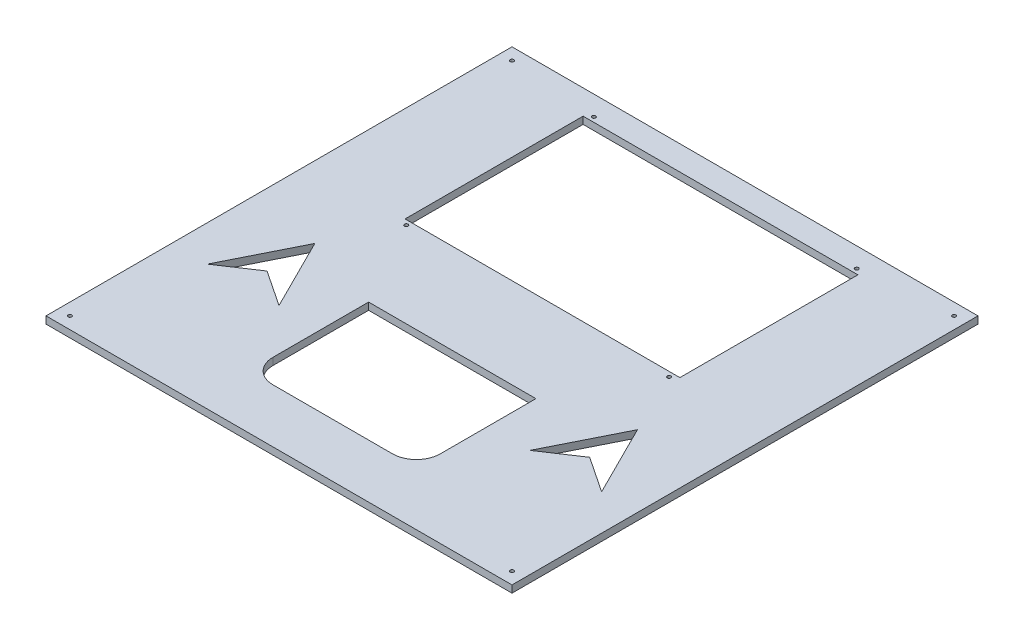
ISO-10303-21;
HEADER;
FILE_DESCRIPTION(('STEP AP214'),'2;1');
FILE_NAME('part.step','',(''),(''),'','','');
FILE_SCHEMA(('AUTOMOTIVE_DESIGN { 1 0 10303 214 1 1 1 1 }'));
ENDSEC;
DATA;
#1=APPLICATION_CONTEXT('core data for automotive mechanical design processes');
#2=APPLICATION_PROTOCOL_DEFINITION('international standard','automotive_design',2000,#1);
#3=PRODUCT_CONTEXT('',#1,'mechanical');
#4=PRODUCT('Part','Part','',(#3));
#5=PRODUCT_RELATED_PRODUCT_CATEGORY('part','',(#4));
#6=PRODUCT_DEFINITION_FORMATION('','',#4);
#7=PRODUCT_DEFINITION_CONTEXT('part definition',#1,'design');
#8=PRODUCT_DEFINITION('design','',#6,#7);
#9=PRODUCT_DEFINITION_SHAPE('','',#8);
#10=(LENGTH_UNIT() NAMED_UNIT(*) SI_UNIT(.MILLI.,.METRE.));
#11=(NAMED_UNIT(*) PLANE_ANGLE_UNIT() SI_UNIT($,.RADIAN.));
#12=(NAMED_UNIT(*) SI_UNIT($,.STERADIAN.) SOLID_ANGLE_UNIT());
#13=UNCERTAINTY_MEASURE_WITH_UNIT(LENGTH_MEASURE(1.E-05),#10,'distance_accuracy_value','');
#14=(GEOMETRIC_REPRESENTATION_CONTEXT(3) GLOBAL_UNCERTAINTY_ASSIGNED_CONTEXT((#13)) GLOBAL_UNIT_ASSIGNED_CONTEXT((#10,
#11,#12)) REPRESENTATION_CONTEXT('',''));
#15=CARTESIAN_POINT('',(0.,0.,0.));
#16=DIRECTION('',(0.,0.,1.));
#17=DIRECTION('',(1.,0.,0.));
#18=AXIS2_PLACEMENT_3D('',#15,#16,#17);
#19=CARTESIAN_POINT('',(0.,6.,0.));
#20=DIRECTION('',(0.,1.,0.));
#21=DIRECTION('',(0.,0.,1.));
#22=AXIS2_PLACEMENT_3D('',#19,#20,#21);
#23=PLANE('',#22);
#24=CARTESIAN_POINT('',(185.,6.,185.));
#25=DIRECTION('',(0.,1.,0.));
#26=DIRECTION('',(0.,0.,1.));
#27=AXIS2_PLACEMENT_3D('',#24,#25,#26);
#28=CIRCLE('',#27,1.5);
#29=CARTESIAN_POINT('',(185.,6.,186.5));
#30=VERTEX_POINT('',#29);
#31=EDGE_CURVE('E300',#30,#30,#28,.T.);
#32=ORIENTED_EDGE('',*,*,#31,.F.);
#33=EDGE_LOOP('',(#32));
#34=FACE_BOUND('',#33,.T.);
#35=CARTESIAN_POINT('',(-185.,6.,-185.));
#36=DIRECTION('',(0.,1.,0.));
#37=DIRECTION('',(0.,0.,1.));
#38=AXIS2_PLACEMENT_3D('',#35,#36,#37);
#39=CIRCLE('',#38,1.5);
#40=CARTESIAN_POINT('',(-185.,6.,-183.5));
#41=VERTEX_POINT('',#40);
#42=EDGE_CURVE('E301',#41,#41,#39,.T.);
#43=ORIENTED_EDGE('',*,*,#42,.F.);
#44=EDGE_LOOP('',(#43));
#45=FACE_BOUND('',#44,.T.);
#46=CARTESIAN_POINT('',(110.,6.,-21.5));
#47=DIRECTION('',(0.,1.,0.));
#48=DIRECTION('',(0.,0.,1.));
#49=AXIS2_PLACEMENT_3D('',#46,#47,#48);
#50=CIRCLE('',#49,1.5);
#51=CARTESIAN_POINT('',(110.,6.,-20.));
#52=VERTEX_POINT('',#51);
#53=EDGE_CURVE('E314',#52,#52,#50,.T.);
#54=ORIENTED_EDGE('',*,*,#53,.F.);
#55=EDGE_LOOP('',(#54));
#56=FACE_BOUND('',#55,.T.);
#57=CARTESIAN_POINT('',(-110.,6.,-178.5));
#58=DIRECTION('',(0.,1.,0.));
#59=DIRECTION('',(0.,0.,1.));
#60=AXIS2_PLACEMENT_3D('',#57,#58,#59);
#61=CIRCLE('',#60,1.5);
#62=CARTESIAN_POINT('',(-110.,6.,-177.));
#63=VERTEX_POINT('',#62);
#64=EDGE_CURVE('E365',#63,#63,#61,.T.);
#65=ORIENTED_EDGE('',*,*,#64,.F.);
#66=EDGE_LOOP('',(#65));
#67=FACE_BOUND('',#66,.T.);
#68=DIRECTION('',(0.,0.,-1.));
#69=VECTOR('',#68,1.);
#70=CARTESIAN_POINT('',(195.,6.,-195.));
#71=LINE('',#70,#69);
#72=CARTESIAN_POINT('',(195.,6.,195.));
#73=VERTEX_POINT('',#72);
#74=CARTESIAN_POINT('',(195.,6.,-195.));
#75=VERTEX_POINT('',#74);
#76=EDGE_CURVE('E445',#73,#75,#71,.T.);
#77=ORIENTED_EDGE('',*,*,#76,.T.);
#78=DIRECTION('',(-1.,0.,0.));
#79=VECTOR('',#78,1.);
#80=CARTESIAN_POINT('',(-195.,6.,-195.));
#81=LINE('',#80,#79);
#82=CARTESIAN_POINT('',(-195.,6.,-195.));
#83=VERTEX_POINT('',#82);
#84=EDGE_CURVE('E449',#75,#83,#81,.T.);
#85=ORIENTED_EDGE('',*,*,#84,.T.);
#86=DIRECTION('',(0.,0.,1.));
#87=VECTOR('',#86,1.);
#88=CARTESIAN_POINT('',(-195.,6.,-195.));
#89=LINE('',#88,#87);
#90=CARTESIAN_POINT('',(-195.,6.,195.));
#91=VERTEX_POINT('',#90);
#92=EDGE_CURVE('E456',#83,#91,#89,.T.);
#93=ORIENTED_EDGE('',*,*,#92,.T.);
#94=DIRECTION('',(1.,0.,0.));
#95=VECTOR('',#94,1.);
#96=CARTESIAN_POINT('',(-195.,6.,195.));
#97=LINE('',#96,#95);
#98=EDGE_CURVE('E459',#91,#73,#97,.T.);
#99=ORIENTED_EDGE('',*,*,#98,.T.);
#100=EDGE_LOOP('',(#77,#85,#93,#99));
#101=FACE_BOUND('',#100,.T.);
#102=DIRECTION('',(-1.,0.,0.));
#103=VECTOR('',#102,1.);
#104=CARTESIAN_POINT('',(-115.,6.,-174.5));
#105=LINE('',#104,#103);
#106=CARTESIAN_POINT('',(115.,6.,-174.5));
#107=VERTEX_POINT('',#106);
#108=CARTESIAN_POINT('',(-115.,6.,-174.5));
#109=VERTEX_POINT('',#108);
#110=EDGE_CURVE('E409',#107,#109,#105,.T.);
#111=ORIENTED_EDGE('',*,*,#110,.F.);
#112=DIRECTION('',(0.,0.,-1.));
#113=VECTOR('',#112,1.);
#114=CARTESIAN_POINT('',(115.,6.,-174.5));
#115=LINE('',#114,#113);
#116=CARTESIAN_POINT('',(115.,6.,-25.5));
#117=VERTEX_POINT('',#116);
#118=EDGE_CURVE('E405',#117,#107,#115,.T.);
#119=ORIENTED_EDGE('',*,*,#118,.F.);
#120=DIRECTION('',(1.,0.,0.));
#121=VECTOR('',#120,1.);
#122=CARTESIAN_POINT('',(-115.,6.,-25.5));
#123=LINE('',#122,#121);
#124=CARTESIAN_POINT('',(-115.,6.,-25.5));
#125=VERTEX_POINT('',#124);
#126=EDGE_CURVE('E418',#125,#117,#123,.T.);
#127=ORIENTED_EDGE('',*,*,#126,.F.);
#128=DIRECTION('',(0.,0.,1.));
#129=VECTOR('',#128,1.);
#130=CARTESIAN_POINT('',(-115.,6.,-174.5));
#131=LINE('',#130,#129);
#132=EDGE_CURVE('E423',#109,#125,#131,.T.);
#133=ORIENTED_EDGE('',*,*,#132,.F.);
#134=EDGE_LOOP('',(#111,#119,#127,#133));
#135=FACE_BOUND('',#134,.T.);
#136=DIRECTION('',(-1.,0.,0.));
#137=VECTOR('',#136,1.);
#138=CARTESIAN_POINT('',(-70.,6.,50.));
#139=LINE('',#138,#137);
#140=CARTESIAN_POINT('',(70.,6.,50.));
#141=VERTEX_POINT('',#140);
#142=CARTESIAN_POINT('',(-70.,6.,50.));
#143=VERTEX_POINT('',#142);
#144=EDGE_CURVE('E341',#141,#143,#139,.T.);
#145=ORIENTED_EDGE('',*,*,#144,.F.);
#146=DIRECTION('',(0.,0.,-1.));
#147=VECTOR('',#146,1.);
#148=CARTESIAN_POINT('',(70.,6.,130.));
#149=LINE('',#148,#147);
#150=CARTESIAN_POINT('',(70.,6.,130.));
#151=VERTEX_POINT('',#150);
#152=EDGE_CURVE('E359',#151,#141,#149,.T.);
#153=ORIENTED_EDGE('',*,*,#152,.F.);
#154=CARTESIAN_POINT('',(50.,6.,130.));
#155=DIRECTION('',(0.,1.,0.));
#156=DIRECTION('',(0.,0.,1.));
#157=AXIS2_PLACEMENT_3D('',#154,#155,#156);
#158=CIRCLE('',#157,20.);
#159=CARTESIAN_POINT('',(50.,6.,150.));
#160=VERTEX_POINT('',#159);
#161=EDGE_CURVE('E352',#160,#151,#158,.T.);
#162=ORIENTED_EDGE('',*,*,#161,.F.);
#163=DIRECTION('',(1.,0.,0.));
#164=VECTOR('',#163,1.);
#165=CARTESIAN_POINT('',(-49.9999999999999,6.,150.));
#166=LINE('',#165,#164);
#167=CARTESIAN_POINT('',(-49.9999999999999,6.,150.));
#168=VERTEX_POINT('',#167);
#169=EDGE_CURVE('E347',#168,#160,#166,.T.);
#170=ORIENTED_EDGE('',*,*,#169,.F.);
#171=CARTESIAN_POINT('',(-50.,6.,130.));
#172=DIRECTION('',(0.,1.,0.));
#173=DIRECTION('',(0.,0.,-1.));
#174=AXIS2_PLACEMENT_3D('',#171,#172,#173);
#175=CIRCLE('',#174,20.);
#176=CARTESIAN_POINT('',(-70.,6.,130.));
#177=VERTEX_POINT('',#176);
#178=EDGE_CURVE('E340',#177,#168,#175,.T.);
#179=ORIENTED_EDGE('',*,*,#178,.F.);
#180=DIRECTION('',(0.,0.,1.));
#181=VECTOR('',#180,1.);
#182=CARTESIAN_POINT('',(-70.,6.,130.));
#183=LINE('',#182,#181);
#184=EDGE_CURVE('E336',#143,#177,#183,.T.);
#185=ORIENTED_EDGE('',*,*,#184,.F.);
#186=EDGE_LOOP('',(#145,#153,#162,#170,#179,#185));
#187=FACE_BOUND('',#186,.T.);
#188=CARTESIAN_POINT('',(-110.,6.,-21.5));
#189=DIRECTION('',(0.,1.,0.));
#190=DIRECTION('',(0.,0.,-1.));
#191=AXIS2_PLACEMENT_3D('',#188,#189,#190);
#192=CIRCLE('',#191,1.5);
#193=CARTESIAN_POINT('',(-110.,6.,-23.));
#194=VERTEX_POINT('',#193);
#195=EDGE_CURVE('E325',#194,#194,#192,.T.);
#196=ORIENTED_EDGE('',*,*,#195,.F.);
#197=EDGE_LOOP('',(#196));
#198=FACE_BOUND('',#197,.T.);
#199=CARTESIAN_POINT('',(110.,6.,-178.5));
#200=DIRECTION('',(0.,1.,0.));
#201=DIRECTION('',(0.,0.,-1.));
#202=AXIS2_PLACEMENT_3D('',#199,#200,#201);
#203=CIRCLE('',#202,1.5);
#204=CARTESIAN_POINT('',(110.,6.,-180.));
#205=VERTEX_POINT('',#204);
#206=EDGE_CURVE('E324',#205,#205,#203,.T.);
#207=ORIENTED_EDGE('',*,*,#206,.F.);
#208=EDGE_LOOP('',(#207));
#209=FACE_BOUND('',#208,.T.);
#210=CARTESIAN_POINT('',(-185.,6.,185.));
#211=DIRECTION('',(0.,1.,0.));
#212=DIRECTION('',(0.,0.,-1.));
#213=AXIS2_PLACEMENT_3D('',#210,#211,#212);
#214=CIRCLE('',#213,1.5);
#215=CARTESIAN_POINT('',(-185.,6.,183.5));
#216=VERTEX_POINT('',#215);
#217=EDGE_CURVE('E290',#216,#216,#214,.T.);
#218=ORIENTED_EDGE('',*,*,#217,.F.);
#219=EDGE_LOOP('',(#218));
#220=FACE_BOUND('',#219,.T.);
#221=CARTESIAN_POINT('',(185.,6.,-185.));
#222=DIRECTION('',(0.,1.,0.));
#223=DIRECTION('',(0.,0.,-1.));
#224=AXIS2_PLACEMENT_3D('',#221,#222,#223);
#225=CIRCLE('',#224,1.5);
#226=CARTESIAN_POINT('',(185.,6.,-186.5));
#227=VERTEX_POINT('',#226);
#228=EDGE_CURVE('E278',#227,#227,#225,.T.);
#229=ORIENTED_EDGE('',*,*,#228,.F.);
#230=EDGE_LOOP('',(#229));
#231=FACE_BOUND('',#230,.T.);
#232=DIRECTION('',(0.832050294337844,0.,0.554700196225228));
#233=VECTOR('',#232,1.);
#234=CARTESIAN_POINT('',(-105.,6.,90.));
#235=LINE('',#234,#233);
#236=CARTESIAN_POINT('',(-135.,6.,70.));
#237=VERTEX_POINT('',#236);
#238=CARTESIAN_POINT('',(-105.,6.,90.));
#239=VERTEX_POINT('',#238);
#240=EDGE_CURVE('E244',#237,#239,#235,.T.);
#241=ORIENTED_EDGE('',*,*,#240,.F.);
#242=DIRECTION('',(0.832050294337843,0.,-0.55470019622523));
#243=VECTOR('',#242,1.);
#244=CARTESIAN_POINT('',(-165.,6.,90.));
#245=LINE('',#244,#243);
#246=CARTESIAN_POINT('',(-165.,6.,90.));
#247=VERTEX_POINT('',#246);
#248=EDGE_CURVE('E240',#247,#237,#245,.T.);
#249=ORIENTED_EDGE('',*,*,#248,.F.);
#250=DIRECTION('',(-0.447213595499958,0.,0.894427190999916));
#251=VECTOR('',#250,1.);
#252=CARTESIAN_POINT('',(-165.,6.,90.));
#253=LINE('',#252,#251);
#254=CARTESIAN_POINT('',(-135.,6.,30.));
#255=VERTEX_POINT('',#254);
#256=EDGE_CURVE('E251',#255,#247,#253,.T.);
#257=ORIENTED_EDGE('',*,*,#256,.F.);
#258=DIRECTION('',(-0.447213595499958,0.,-0.894427190999916));
#259=VECTOR('',#258,1.);
#260=CARTESIAN_POINT('',(-105.,6.,90.));
#261=LINE('',#260,#259);
#262=EDGE_CURVE('E256',#239,#255,#261,.T.);
#263=ORIENTED_EDGE('',*,*,#262,.F.);
#264=EDGE_LOOP('',(#241,#249,#257,#263));
#265=FACE_BOUND('',#264,.T.);
#266=DIRECTION('',(0.832050294337844,0.,0.554700196225229));
#267=VECTOR('',#266,1.);
#268=CARTESIAN_POINT('',(165.,6.,90.));
#269=LINE('',#268,#267);
#270=CARTESIAN_POINT('',(135.,6.,70.));
#271=VERTEX_POINT('',#270);
#272=CARTESIAN_POINT('',(165.,6.,90.));
#273=VERTEX_POINT('',#272);
#274=EDGE_CURVE('E200',#271,#273,#269,.T.);
#275=ORIENTED_EDGE('',*,*,#274,.F.);
#276=DIRECTION('',(0.832050294337844,0.,-0.554700196225229));
#277=VECTOR('',#276,1.);
#278=CARTESIAN_POINT('',(105.,6.,90.));
#279=LINE('',#278,#277);
#280=CARTESIAN_POINT('',(105.,6.,90.));
#281=VERTEX_POINT('',#280);
#282=EDGE_CURVE('E191',#281,#271,#279,.T.);
#283=ORIENTED_EDGE('',*,*,#282,.F.);
#284=DIRECTION('',(-0.447213595499959,0.,0.894427190999915));
#285=VECTOR('',#284,1.);
#286=CARTESIAN_POINT('',(105.,6.,90.));
#287=LINE('',#286,#285);
#288=CARTESIAN_POINT('',(135.,6.,30.));
#289=VERTEX_POINT('',#288);
#290=EDGE_CURVE('E217',#289,#281,#287,.T.);
#291=ORIENTED_EDGE('',*,*,#290,.F.);
#292=DIRECTION('',(-0.447213595499957,0.,-0.894427190999917));
#293=VECTOR('',#292,1.);
#294=CARTESIAN_POINT('',(165.,6.,90.));
#295=LINE('',#294,#293);
#296=EDGE_CURVE('E212',#273,#289,#295,.T.);
#297=ORIENTED_EDGE('',*,*,#296,.F.);
#298=EDGE_LOOP('',(#275,#283,#291,#297));
#299=FACE_BOUND('',#298,.T.);
#300=ADVANCED_FACE('F42',(#34,#45,#56,#67,#101,#135,#187,#198,#209,#220,#231,#265,#299),#23,.T.);
#301=CARTESIAN_POINT('',(0.,0.,0.));
#302=DIRECTION('',(0.,1.,0.));
#303=DIRECTION('',(0.,0.,1.));
#304=AXIS2_PLACEMENT_3D('',#301,#302,#303);
#305=PLANE('',#304);
#306=DIRECTION('',(0.832050294337843,0.,-0.55470019622523));
#307=VECTOR('',#306,1.);
#308=CARTESIAN_POINT('',(-165.,0.,90.));
#309=LINE('',#308,#307);
#310=CARTESIAN_POINT('',(-165.,0.,90.));
#311=VERTEX_POINT('',#310);
#312=CARTESIAN_POINT('',(-135.,0.,70.));
#313=VERTEX_POINT('',#312);
#314=EDGE_CURVE('E208',#311,#313,#309,.T.);
#315=ORIENTED_EDGE('',*,*,#314,.T.);
#316=DIRECTION('',(0.832050294337844,0.,0.554700196225228));
#317=VECTOR('',#316,1.);
#318=CARTESIAN_POINT('',(-105.,0.,90.));
#319=LINE('',#318,#317);
#320=CARTESIAN_POINT('',(-105.,0.,90.));
#321=VERTEX_POINT('',#320);
#322=EDGE_CURVE('E260',#313,#321,#319,.T.);
#323=ORIENTED_EDGE('',*,*,#322,.T.);
#324=DIRECTION('',(-0.447213595499958,0.,-0.894427190999916));
#325=VECTOR('',#324,1.);
#326=CARTESIAN_POINT('',(-105.,0.,90.));
#327=LINE('',#326,#325);
#328=CARTESIAN_POINT('',(-135.,0.,30.));
#329=VERTEX_POINT('',#328);
#330=EDGE_CURVE('E263',#321,#329,#327,.T.);
#331=ORIENTED_EDGE('',*,*,#330,.T.);
#332=DIRECTION('',(-0.447213595499958,0.,0.894427190999916));
#333=VECTOR('',#332,1.);
#334=CARTESIAN_POINT('',(-165.,0.,90.));
#335=LINE('',#334,#333);
#336=EDGE_CURVE('E245',#329,#311,#335,.T.);
#337=ORIENTED_EDGE('',*,*,#336,.T.);
#338=EDGE_LOOP('',(#315,#323,#331,#337));
#339=FACE_BOUND('',#338,.T.);
#340=DIRECTION('',(0.,0.,-1.));
#341=VECTOR('',#340,1.);
#342=CARTESIAN_POINT('',(115.,0.,-174.5));
#343=LINE('',#342,#341);
#344=CARTESIAN_POINT('',(115.,0.,-25.5));
#345=VERTEX_POINT('',#344);
#346=CARTESIAN_POINT('',(115.,0.,-174.5));
#347=VERTEX_POINT('',#346);
#348=EDGE_CURVE('E404',#345,#347,#343,.T.);
#349=ORIENTED_EDGE('',*,*,#348,.T.);
#350=DIRECTION('',(-1.,0.,0.));
#351=VECTOR('',#350,1.);
#352=CARTESIAN_POINT('',(-115.,0.,-174.5));
#353=LINE('',#352,#351);
#354=CARTESIAN_POINT('',(-115.,0.,-174.5));
#355=VERTEX_POINT('',#354);
#356=EDGE_CURVE('E427',#347,#355,#353,.T.);
#357=ORIENTED_EDGE('',*,*,#356,.T.);
#358=DIRECTION('',(0.,0.,1.));
#359=VECTOR('',#358,1.);
#360=CARTESIAN_POINT('',(-115.,0.,-174.5));
#361=LINE('',#360,#359);
#362=CARTESIAN_POINT('',(-115.,0.,-25.5));
#363=VERTEX_POINT('',#362);
#364=EDGE_CURVE('E430',#355,#363,#361,.T.);
#365=ORIENTED_EDGE('',*,*,#364,.T.);
#366=DIRECTION('',(1.,0.,0.));
#367=VECTOR('',#366,1.);
#368=CARTESIAN_POINT('',(-115.,0.,-25.5));
#369=LINE('',#368,#367);
#370=EDGE_CURVE('E410',#363,#345,#369,.T.);
#371=ORIENTED_EDGE('',*,*,#370,.T.);
#372=EDGE_LOOP('',(#349,#357,#365,#371));
#373=FACE_BOUND('',#372,.T.);
#374=DIRECTION('',(0.,0.,-1.));
#375=VECTOR('',#374,1.);
#376=CARTESIAN_POINT('',(195.,0.,-195.));
#377=LINE('',#376,#375);
#378=CARTESIAN_POINT('',(195.,0.,195.));
#379=VERTEX_POINT('',#378);
#380=CARTESIAN_POINT('',(195.,0.,-195.));
#381=VERTEX_POINT('',#380);
#382=EDGE_CURVE('E444',#379,#381,#377,.T.);
#383=ORIENTED_EDGE('',*,*,#382,.F.);
#384=DIRECTION('',(1.,0.,0.));
#385=VECTOR('',#384,1.);
#386=CARTESIAN_POINT('',(-195.,0.,195.));
#387=LINE('',#386,#385);
#388=CARTESIAN_POINT('',(-195.,0.,195.));
#389=VERTEX_POINT('',#388);
#390=EDGE_CURVE('E450',#389,#379,#387,.T.);
#391=ORIENTED_EDGE('',*,*,#390,.F.);
#392=DIRECTION('',(0.,0.,1.));
#393=VECTOR('',#392,1.);
#394=CARTESIAN_POINT('',(-195.,0.,-195.));
#395=LINE('',#394,#393);
#396=CARTESIAN_POINT('',(-195.,0.,-195.));
#397=VERTEX_POINT('',#396);
#398=EDGE_CURVE('E468',#397,#389,#395,.T.);
#399=ORIENTED_EDGE('',*,*,#398,.F.);
#400=DIRECTION('',(-1.,0.,0.));
#401=VECTOR('',#400,1.);
#402=CARTESIAN_POINT('',(-195.,0.,-195.));
#403=LINE('',#402,#401);
#404=EDGE_CURVE('E466',#381,#397,#403,.T.);
#405=ORIENTED_EDGE('',*,*,#404,.F.);
#406=EDGE_LOOP('',(#383,#391,#399,#405));
#407=FACE_BOUND('',#406,.T.);
#408=DIRECTION('',(0.,0.,-1.));
#409=VECTOR('',#408,1.);
#410=CARTESIAN_POINT('',(70.,0.,130.));
#411=LINE('',#410,#409);
#412=CARTESIAN_POINT('',(70.,0.,130.));
#413=VERTEX_POINT('',#412);
#414=CARTESIAN_POINT('',(70.,0.,50.));
#415=VERTEX_POINT('',#414);
#416=EDGE_CURVE('E369',#413,#415,#411,.T.);
#417=ORIENTED_EDGE('',*,*,#416,.T.);
#418=DIRECTION('',(-1.,0.,0.));
#419=VECTOR('',#418,1.);
#420=CARTESIAN_POINT('',(-70.,0.,50.));
#421=LINE('',#420,#419);
#422=CARTESIAN_POINT('',(-70.,0.,50.));
#423=VERTEX_POINT('',#422);
#424=EDGE_CURVE('E374',#415,#423,#421,.T.);
#425=ORIENTED_EDGE('',*,*,#424,.T.);
#426=DIRECTION('',(0.,0.,1.));
#427=VECTOR('',#426,1.);
#428=CARTESIAN_POINT('',(-70.,0.,130.));
#429=LINE('',#428,#427);
#430=CARTESIAN_POINT('',(-70.,0.,130.));
#431=VERTEX_POINT('',#430);
#432=EDGE_CURVE('E378',#423,#431,#429,.T.);
#433=ORIENTED_EDGE('',*,*,#432,.T.);
#434=CARTESIAN_POINT('',(-50.,0.,130.));
#435=DIRECTION('',(0.,1.,0.));
#436=DIRECTION('',(0.,0.,-1.));
#437=AXIS2_PLACEMENT_3D('',#434,#435,#436);
#438=CIRCLE('',#437,20.);
#439=CARTESIAN_POINT('',(-49.9999999999999,0.,150.));
#440=VERTEX_POINT('',#439);
#441=EDGE_CURVE('E383',#431,#440,#438,.T.);
#442=ORIENTED_EDGE('',*,*,#441,.T.);
#443=DIRECTION('',(1.,0.,0.));
#444=VECTOR('',#443,1.);
#445=CARTESIAN_POINT('',(-49.9999999999999,0.,150.));
#446=LINE('',#445,#444);
#447=CARTESIAN_POINT('',(49.9999999999999,0.,150.));
#448=VERTEX_POINT('',#447);
#449=EDGE_CURVE('E386',#440,#448,#446,.T.);
#450=ORIENTED_EDGE('',*,*,#449,.T.);
#451=CARTESIAN_POINT('',(50.,0.,130.));
#452=DIRECTION('',(0.,1.,0.));
#453=DIRECTION('',(0.,0.,1.));
#454=AXIS2_PLACEMENT_3D('',#451,#452,#453);
#455=CIRCLE('',#454,20.);
#456=EDGE_CURVE('E363',#448,#413,#455,.T.);
#457=ORIENTED_EDGE('',*,*,#456,.T.);
#458=EDGE_LOOP('',(#417,#425,#433,#442,#450,#457));
#459=FACE_BOUND('',#458,.T.);
#460=CARTESIAN_POINT('',(-110.,0.,-178.5));
#461=DIRECTION('',(0.,1.,0.));
#462=DIRECTION('',(0.,0.,1.));
#463=AXIS2_PLACEMENT_3D('',#460,#461,#462);
#464=CIRCLE('',#463,1.5);
#465=CARTESIAN_POINT('',(-110.,0.,-177.));
#466=VERTEX_POINT('',#465);
#467=EDGE_CURVE('E330',#466,#466,#464,.T.);
#468=ORIENTED_EDGE('',*,*,#467,.T.);
#469=EDGE_LOOP('',(#468));
#470=FACE_BOUND('',#469,.T.);
#471=CARTESIAN_POINT('',(-110.,0.,-21.5));
#472=DIRECTION('',(0.,1.,0.));
#473=DIRECTION('',(0.,0.,-1.));
#474=AXIS2_PLACEMENT_3D('',#471,#472,#473);
#475=CIRCLE('',#474,1.5);
#476=CARTESIAN_POINT('',(-110.,0.,-23.));
#477=VERTEX_POINT('',#476);
#478=EDGE_CURVE('E320',#477,#477,#475,.T.);
#479=ORIENTED_EDGE('',*,*,#478,.T.);
#480=EDGE_LOOP('',(#479));
#481=FACE_BOUND('',#480,.T.);
#482=CARTESIAN_POINT('',(110.,0.,-21.5));
#483=DIRECTION('',(0.,1.,0.));
#484=DIRECTION('',(0.,0.,1.));
#485=AXIS2_PLACEMENT_3D('',#482,#483,#484);
#486=CIRCLE('',#485,1.5);
#487=CARTESIAN_POINT('',(110.,0.,-20.));
#488=VERTEX_POINT('',#487);
#489=EDGE_CURVE('E321',#488,#488,#486,.T.);
#490=ORIENTED_EDGE('',*,*,#489,.T.);
#491=EDGE_LOOP('',(#490));
#492=FACE_BOUND('',#491,.T.);
#493=CARTESIAN_POINT('',(110.,0.,-178.5));
#494=DIRECTION('',(0.,1.,0.));
#495=DIRECTION('',(0.,0.,-1.));
#496=AXIS2_PLACEMENT_3D('',#493,#494,#495);
#497=CIRCLE('',#496,1.5);
#498=CARTESIAN_POINT('',(110.,0.,-180.));
#499=VERTEX_POINT('',#498);
#500=EDGE_CURVE('E306',#499,#499,#497,.T.);
#501=ORIENTED_EDGE('',*,*,#500,.T.);
#502=EDGE_LOOP('',(#501));
#503=FACE_BOUND('',#502,.T.);
#504=CARTESIAN_POINT('',(-185.,0.,-185.));
#505=DIRECTION('',(0.,1.,0.));
#506=DIRECTION('',(0.,0.,1.));
#507=AXIS2_PLACEMENT_3D('',#504,#505,#506);
#508=CIRCLE('',#507,1.5);
#509=CARTESIAN_POINT('',(-185.,0.,-183.5));
#510=VERTEX_POINT('',#509);
#511=EDGE_CURVE('E296',#510,#510,#508,.T.);
#512=ORIENTED_EDGE('',*,*,#511,.T.);
#513=EDGE_LOOP('',(#512));
#514=FACE_BOUND('',#513,.T.);
#515=CARTESIAN_POINT('',(-185.,0.,185.));
#516=DIRECTION('',(0.,1.,0.));
#517=DIRECTION('',(0.,0.,-1.));
#518=AXIS2_PLACEMENT_3D('',#515,#516,#517);
#519=CIRCLE('',#518,1.5);
#520=CARTESIAN_POINT('',(-185.,0.,183.5));
#521=VERTEX_POINT('',#520);
#522=EDGE_CURVE('E297',#521,#521,#519,.T.);
#523=ORIENTED_EDGE('',*,*,#522,.T.);
#524=EDGE_LOOP('',(#523));
#525=FACE_BOUND('',#524,.T.);
#526=CARTESIAN_POINT('',(185.,0.,185.));
#527=DIRECTION('',(0.,1.,0.));
#528=DIRECTION('',(0.,0.,1.));
#529=AXIS2_PLACEMENT_3D('',#526,#527,#528);
#530=CIRCLE('',#529,1.5);
#531=CARTESIAN_POINT('',(185.,0.,186.5));
#532=VERTEX_POINT('',#531);
#533=EDGE_CURVE('E283',#532,#532,#530,.T.);
#534=ORIENTED_EDGE('',*,*,#533,.T.);
#535=EDGE_LOOP('',(#534));
#536=FACE_BOUND('',#535,.T.);
#537=CARTESIAN_POINT('',(185.,0.,-185.));
#538=DIRECTION('',(0.,1.,0.));
#539=DIRECTION('',(0.,0.,-1.));
#540=AXIS2_PLACEMENT_3D('',#537,#538,#539);
#541=CIRCLE('',#540,1.5);
#542=CARTESIAN_POINT('',(185.,0.,-186.5));
#543=VERTEX_POINT('',#542);
#544=EDGE_CURVE('E277',#543,#543,#541,.T.);
#545=ORIENTED_EDGE('',*,*,#544,.T.);
#546=EDGE_LOOP('',(#545));
#547=FACE_BOUND('',#546,.T.);
#548=DIRECTION('',(0.832050294337844,0.,-0.554700196225229));
#549=VECTOR('',#548,1.);
#550=CARTESIAN_POINT('',(105.,0.,90.));
#551=LINE('',#550,#549);
#552=CARTESIAN_POINT('',(105.,0.,90.));
#553=VERTEX_POINT('',#552);
#554=CARTESIAN_POINT('',(135.,0.,70.));
#555=VERTEX_POINT('',#554);
#556=EDGE_CURVE('E65',#553,#555,#551,.T.);
#557=ORIENTED_EDGE('',*,*,#556,.T.);
#558=DIRECTION('',(0.832050294337844,0.,0.554700196225229));
#559=VECTOR('',#558,1.);
#560=CARTESIAN_POINT('',(165.,0.,90.));
#561=LINE('',#560,#559);
#562=CARTESIAN_POINT('',(165.,0.,90.));
#563=VERTEX_POINT('',#562);
#564=EDGE_CURVE('E207',#555,#563,#561,.T.);
#565=ORIENTED_EDGE('',*,*,#564,.T.);
#566=DIRECTION('',(-0.447213595499957,0.,-0.894427190999917));
#567=VECTOR('',#566,1.);
#568=CARTESIAN_POINT('',(165.,0.,90.));
#569=LINE('',#568,#567);
#570=CARTESIAN_POINT('',(135.,0.,30.));
#571=VERTEX_POINT('',#570);
#572=EDGE_CURVE('E232',#563,#571,#569,.T.);
#573=ORIENTED_EDGE('',*,*,#572,.T.);
#574=DIRECTION('',(-0.447213595499959,0.,0.894427190999915));
#575=VECTOR('',#574,1.);
#576=CARTESIAN_POINT('',(105.,0.,90.));
#577=LINE('',#576,#575);
#578=EDGE_CURVE('E201',#571,#553,#577,.T.);
#579=ORIENTED_EDGE('',*,*,#578,.T.);
#580=EDGE_LOOP('',(#557,#565,#573,#579));
#581=FACE_BOUND('',#580,.T.);
#582=ADVANCED_FACE('F486',(#339,#373,#407,#459,#470,#481,#492,#503,#514,#525,#536,#547,#581),
#305,.F.);
#583=CARTESIAN_POINT('',(195.,6.,-195.));
#584=DIRECTION('',(-1.,0.,0.));
#585=DIRECTION('',(0.,0.,1.));
#586=AXIS2_PLACEMENT_3D('',#583,#584,#585);
#587=PLANE('',#586);
#588=ORIENTED_EDGE('',*,*,#382,.T.);
#589=DIRECTION('',(0.,-1.,0.));
#590=VECTOR('',#589,1.);
#591=CARTESIAN_POINT('',(195.,6.,-195.));
#592=LINE('',#591,#590);
#593=EDGE_CURVE('E12',#75,#381,#592,.T.);
#594=ORIENTED_EDGE('',*,*,#593,.F.);
#595=ORIENTED_EDGE('',*,*,#76,.F.);
#596=DIRECTION('',(0.,-1.,0.));
#597=VECTOR('',#596,1.);
#598=CARTESIAN_POINT('',(195.,6.,195.));
#599=LINE('',#598,#597);
#600=EDGE_CURVE('E463',#73,#379,#599,.T.);
#601=ORIENTED_EDGE('',*,*,#600,.T.);
#602=EDGE_LOOP('',(#588,#594,#595,#601));
#603=FACE_BOUND('',#602,.T.);
#604=ADVANCED_FACE('F44',(#603),#587,.F.);
#605=CARTESIAN_POINT('',(-195.,6.,-195.));
#606=DIRECTION('',(0.,0.,1.));
#607=DIRECTION('',(1.,0.,0.));
#608=AXIS2_PLACEMENT_3D('',#605,#606,#607);
#609=PLANE('',#608);
#610=ORIENTED_EDGE('',*,*,#404,.T.);
#611=DIRECTION('',(0.,-1.,0.));
#612=VECTOR('',#611,1.);
#613=CARTESIAN_POINT('',(-195.,6.,-195.));
#614=LINE('',#613,#612);
#615=EDGE_CURVE('E50',#83,#397,#614,.T.);
#616=ORIENTED_EDGE('',*,*,#615,.F.);
#617=ORIENTED_EDGE('',*,*,#84,.F.);
#618=ORIENTED_EDGE('',*,*,#593,.T.);
#619=EDGE_LOOP('',(#610,#616,#617,#618));
#620=FACE_BOUND('',#619,.T.);
#621=ADVANCED_FACE('F551',(#620),#609,.F.);
#622=CARTESIAN_POINT('',(-195.,6.,-195.));
#623=DIRECTION('',(1.,0.,0.));
#624=DIRECTION('',(0.,0.,-1.));
#625=AXIS2_PLACEMENT_3D('',#622,#623,#624);
#626=PLANE('',#625);
#627=ORIENTED_EDGE('',*,*,#398,.T.);
#628=DIRECTION('',(0.,-1.,0.));
#629=VECTOR('',#628,1.);
#630=CARTESIAN_POINT('',(-195.,6.,195.));
#631=LINE('',#630,#629);
#632=EDGE_CURVE('E473',#91,#389,#631,.T.);
#633=ORIENTED_EDGE('',*,*,#632,.F.);
#634=ORIENTED_EDGE('',*,*,#92,.F.);
#635=ORIENTED_EDGE('',*,*,#615,.T.);
#636=EDGE_LOOP('',(#627,#633,#634,#635));
#637=FACE_BOUND('',#636,.T.);
#638=ADVANCED_FACE('F480',(#637),#626,.F.);
#639=CARTESIAN_POINT('',(-195.,6.,195.));
#640=DIRECTION('',(0.,0.,-1.));
#641=DIRECTION('',(-1.,0.,0.));
#642=AXIS2_PLACEMENT_3D('',#639,#640,#641);
#643=PLANE('',#642);
#644=ORIENTED_EDGE('',*,*,#390,.T.);
#645=ORIENTED_EDGE('',*,*,#600,.F.);
#646=ORIENTED_EDGE('',*,*,#98,.F.);
#647=ORIENTED_EDGE('',*,*,#632,.T.);
#648=EDGE_LOOP('',(#644,#645,#646,#647));
#649=FACE_BOUND('',#648,.T.);
#650=ADVANCED_FACE('F489',(#649),#643,.F.);
#651=CARTESIAN_POINT('',(115.,6.,-174.5));
#652=DIRECTION('',(-1.,0.,0.));
#653=DIRECTION('',(0.,0.,1.));
#654=AXIS2_PLACEMENT_3D('',#651,#652,#653);
#655=PLANE('',#654);
#656=ORIENTED_EDGE('',*,*,#348,.F.);
#657=DIRECTION('',(0.,-1.,0.));
#658=VECTOR('',#657,1.);
#659=CARTESIAN_POINT('',(115.,6.,-25.5));
#660=LINE('',#659,#658);
#661=EDGE_CURVE('E422',#117,#345,#660,.T.);
#662=ORIENTED_EDGE('',*,*,#661,.F.);
#663=ORIENTED_EDGE('',*,*,#118,.T.);
#664=DIRECTION('',(0.,-1.,0.));
#665=VECTOR('',#664,1.);
#666=CARTESIAN_POINT('',(115.,6.,-174.5));
#667=LINE('',#666,#665);
#668=EDGE_CURVE('E441',#107,#347,#667,.T.);
#669=ORIENTED_EDGE('',*,*,#668,.T.);
#670=EDGE_LOOP('',(#656,#662,#663,#669));
#671=FACE_BOUND('',#670,.T.);
#672=ADVANCED_FACE('F545',(#671),#655,.T.);
#673=CARTESIAN_POINT('',(-115.,6.,-174.5));
#674=DIRECTION('',(0.,0.,1.));
#675=DIRECTION('',(1.,0.,0.));
#676=AXIS2_PLACEMENT_3D('',#673,#674,#675);
#677=PLANE('',#676);
#678=ORIENTED_EDGE('',*,*,#356,.F.);
#679=ORIENTED_EDGE('',*,*,#668,.F.);
#680=ORIENTED_EDGE('',*,*,#110,.T.);
#681=DIRECTION('',(0.,-1.,0.));
#682=VECTOR('',#681,1.);
#683=CARTESIAN_POINT('',(-115.,6.,-174.5));
#684=LINE('',#683,#682);
#685=EDGE_CURVE('E439',#109,#355,#684,.T.);
#686=ORIENTED_EDGE('',*,*,#685,.T.);
#687=EDGE_LOOP('',(#678,#679,#680,#686));
#688=FACE_BOUND('',#687,.T.);
#689=ADVANCED_FACE('F600',(#688),#677,.T.);
#690=CARTESIAN_POINT('',(-115.,6.,-174.5));
#691=DIRECTION('',(1.,0.,0.));
#692=DIRECTION('',(0.,0.,-1.));
#693=AXIS2_PLACEMENT_3D('',#690,#691,#692);
#694=PLANE('',#693);
#695=ORIENTED_EDGE('',*,*,#364,.F.);
#696=ORIENTED_EDGE('',*,*,#685,.F.);
#697=ORIENTED_EDGE('',*,*,#132,.T.);
#698=DIRECTION('',(0.,-1.,0.));
#699=VECTOR('',#698,1.);
#700=CARTESIAN_POINT('',(-115.,6.,-25.5));
#701=LINE('',#700,#699);
#702=EDGE_CURVE('E437',#125,#363,#701,.T.);
#703=ORIENTED_EDGE('',*,*,#702,.T.);
#704=EDGE_LOOP('',(#695,#696,#697,#703));
#705=FACE_BOUND('',#704,.T.);
#706=ADVANCED_FACE('F609',(#705),#694,.T.);
#707=CARTESIAN_POINT('',(-115.,6.,-25.5));
#708=DIRECTION('',(0.,0.,-1.));
#709=DIRECTION('',(-1.,0.,0.));
#710=AXIS2_PLACEMENT_3D('',#707,#708,#709);
#711=PLANE('',#710);
#712=ORIENTED_EDGE('',*,*,#370,.F.);
#713=ORIENTED_EDGE('',*,*,#702,.F.);
#714=ORIENTED_EDGE('',*,*,#126,.T.);
#715=ORIENTED_EDGE('',*,*,#661,.T.);
#716=EDGE_LOOP('',(#712,#713,#714,#715));
#717=FACE_BOUND('',#716,.T.);
#718=ADVANCED_FACE('F618',(#717),#711,.T.);
#719=CARTESIAN_POINT('',(70.,6.,130.));
#720=DIRECTION('',(-1.,0.,0.));
#721=DIRECTION('',(0.,0.,1.));
#722=AXIS2_PLACEMENT_3D('',#719,#720,#721);
#723=PLANE('',#722);
#724=ORIENTED_EDGE('',*,*,#416,.F.);
#725=DIRECTION('',(0.,-1.,0.));
#726=VECTOR('',#725,1.);
#727=CARTESIAN_POINT('',(70.,6.,130.));
#728=LINE('',#727,#726);
#729=EDGE_CURVE('E390',#151,#413,#728,.T.);
#730=ORIENTED_EDGE('',*,*,#729,.F.);
#731=ORIENTED_EDGE('',*,*,#152,.T.);
#732=DIRECTION('',(0.,-1.,0.));
#733=VECTOR('',#732,1.);
#734=CARTESIAN_POINT('',(70.,6.,50.));
#735=LINE('',#734,#733);
#736=EDGE_CURVE('E401',#141,#415,#735,.T.);
#737=ORIENTED_EDGE('',*,*,#736,.T.);
#738=EDGE_LOOP('',(#724,#730,#731,#737));
#739=FACE_BOUND('',#738,.T.);
#740=ADVANCED_FACE('F628',(#739),#723,.T.);
#741=CARTESIAN_POINT('',(-70.,6.,50.));
#742=DIRECTION('',(0.,0.,1.));
#743=DIRECTION('',(1.,0.,0.));
#744=AXIS2_PLACEMENT_3D('',#741,#742,#743);
#745=PLANE('',#744);
#746=ORIENTED_EDGE('',*,*,#424,.F.);
#747=ORIENTED_EDGE('',*,*,#736,.F.);
#748=ORIENTED_EDGE('',*,*,#144,.T.);
#749=DIRECTION('',(0.,-1.,0.));
#750=VECTOR('',#749,1.);
#751=CARTESIAN_POINT('',(-70.,6.,50.));
#752=LINE('',#751,#750);
#753=EDGE_CURVE('E399',#143,#423,#752,.T.);
#754=ORIENTED_EDGE('',*,*,#753,.T.);
#755=EDGE_LOOP('',(#746,#747,#748,#754));
#756=FACE_BOUND('',#755,.T.);
#757=ADVANCED_FACE('F638',(#756),#745,.T.);
#758=CARTESIAN_POINT('',(-70.,6.,130.));
#759=DIRECTION('',(1.,0.,0.));
#760=DIRECTION('',(0.,0.,-1.));
#761=AXIS2_PLACEMENT_3D('',#758,#759,#760);
#762=PLANE('',#761);
#763=ORIENTED_EDGE('',*,*,#432,.F.);
#764=ORIENTED_EDGE('',*,*,#753,.F.);
#765=ORIENTED_EDGE('',*,*,#184,.T.);
#766=DIRECTION('',(0.,-1.,0.));
#767=VECTOR('',#766,1.);
#768=CARTESIAN_POINT('',(-70.,6.,130.));
#769=LINE('',#768,#767);
#770=EDGE_CURVE('E397',#177,#431,#769,.T.);
#771=ORIENTED_EDGE('',*,*,#770,.T.);
#772=EDGE_LOOP('',(#763,#764,#765,#771));
#773=FACE_BOUND('',#772,.T.);
#774=ADVANCED_FACE('F648',(#773),#762,.T.);
#775=CARTESIAN_POINT('',(-50.,6.,130.));
#776=DIRECTION('',(0.,-1.,0.));
#777=DIRECTION('',(0.,0.,-1.));
#778=AXIS2_PLACEMENT_3D('',#775,#776,#777);
#779=CYLINDRICAL_SURFACE('',#778,20.);
#780=ORIENTED_EDGE('',*,*,#441,.F.);
#781=ORIENTED_EDGE('',*,*,#770,.F.);
#782=ORIENTED_EDGE('',*,*,#178,.T.);
#783=DIRECTION('',(0.,-1.,0.));
#784=VECTOR('',#783,1.);
#785=CARTESIAN_POINT('',(-49.9999999999999,6.,150.));
#786=LINE('',#785,#784);
#787=EDGE_CURVE('E395',#168,#440,#786,.T.);
#788=ORIENTED_EDGE('',*,*,#787,.T.);
#789=EDGE_LOOP('',(#780,#781,#782,#788));
#790=FACE_BOUND('',#789,.T.);
#791=ADVANCED_FACE('F658',(#790),#779,.F.);
#792=CARTESIAN_POINT('',(-49.9999999999999,6.,150.));
#793=DIRECTION('',(0.,0.,-1.));
#794=DIRECTION('',(-1.,0.,0.));
#795=AXIS2_PLACEMENT_3D('',#792,#793,#794);
#796=PLANE('',#795);
#797=ORIENTED_EDGE('',*,*,#449,.F.);
#798=ORIENTED_EDGE('',*,*,#787,.F.);
#799=ORIENTED_EDGE('',*,*,#169,.T.);
#800=DIRECTION('',(0.,-1.,0.));
#801=VECTOR('',#800,1.);
#802=CARTESIAN_POINT('',(49.9999999999999,6.,150.));
#803=LINE('',#802,#801);
#804=EDGE_CURVE('E393',#160,#448,#803,.T.);
#805=ORIENTED_EDGE('',*,*,#804,.T.);
#806=EDGE_LOOP('',(#797,#798,#799,#805));
#807=FACE_BOUND('',#806,.T.);
#808=ADVANCED_FACE('F668',(#807),#796,.T.);
#809=CARTESIAN_POINT('',(50.,6.,130.));
#810=DIRECTION('',(0.,-1.,0.));
#811=DIRECTION('',(0.,0.,-1.));
#812=AXIS2_PLACEMENT_3D('',#809,#810,#811);
#813=CYLINDRICAL_SURFACE('',#812,20.);
#814=ORIENTED_EDGE('',*,*,#456,.F.);
#815=ORIENTED_EDGE('',*,*,#804,.F.);
#816=ORIENTED_EDGE('',*,*,#161,.T.);
#817=ORIENTED_EDGE('',*,*,#729,.T.);
#818=EDGE_LOOP('',(#814,#815,#816,#817));
#819=FACE_BOUND('',#818,.T.);
#820=ADVANCED_FACE('F678',(#819),#813,.F.);
#821=CARTESIAN_POINT('',(-110.,6.,-178.5));
#822=DIRECTION('',(0.,-1.,0.));
#823=DIRECTION('',(0.,0.,-1.));
#824=AXIS2_PLACEMENT_3D('',#821,#822,#823);
#825=CYLINDRICAL_SURFACE('',#824,1.5);
#826=ORIENTED_EDGE('',*,*,#64,.T.);
#827=EDGE_LOOP('',(#826));
#828=FACE_BOUND('',#827,.T.);
#829=ORIENTED_EDGE('',*,*,#467,.F.);
#830=EDGE_LOOP('',(#829));
#831=FACE_BOUND('',#830,.T.);
#832=ADVANCED_FACE('F688',(#828,#831),#825,.F.);
#833=CARTESIAN_POINT('',(-110.,6.,-21.5));
#834=DIRECTION('',(0.,-1.,0.));
#835=DIRECTION('',(0.,0.,-1.));
#836=AXIS2_PLACEMENT_3D('',#833,#834,#835);
#837=CYLINDRICAL_SURFACE('',#836,1.5);
#838=ORIENTED_EDGE('',*,*,#195,.T.);
#839=EDGE_LOOP('',(#838));
#840=FACE_BOUND('',#839,.T.);
#841=ORIENTED_EDGE('',*,*,#478,.F.);
#842=EDGE_LOOP('',(#841));
#843=FACE_BOUND('',#842,.T.);
#844=ADVANCED_FACE('F698',(#840,#843),#837,.F.);
#845=CARTESIAN_POINT('',(110.,6.,-21.5));
#846=DIRECTION('',(0.,-1.,0.));
#847=DIRECTION('',(0.,0.,-1.));
#848=AXIS2_PLACEMENT_3D('',#845,#846,#847);
#849=CYLINDRICAL_SURFACE('',#848,1.5);
#850=ORIENTED_EDGE('',*,*,#53,.T.);
#851=EDGE_LOOP('',(#850));
#852=FACE_BOUND('',#851,.T.);
#853=ORIENTED_EDGE('',*,*,#489,.F.);
#854=EDGE_LOOP('',(#853));
#855=FACE_BOUND('',#854,.T.);
#856=ADVANCED_FACE('F707',(#852,#855),#849,.F.);
#857=CARTESIAN_POINT('',(110.,6.,-178.5));
#858=DIRECTION('',(0.,-1.,0.));
#859=DIRECTION('',(0.,0.,-1.));
#860=AXIS2_PLACEMENT_3D('',#857,#858,#859);
#861=CYLINDRICAL_SURFACE('',#860,1.5);
#862=ORIENTED_EDGE('',*,*,#206,.T.);
#863=EDGE_LOOP('',(#862));
#864=FACE_BOUND('',#863,.T.);
#865=ORIENTED_EDGE('',*,*,#500,.F.);
#866=EDGE_LOOP('',(#865));
#867=FACE_BOUND('',#866,.T.);
#868=ADVANCED_FACE('F717',(#864,#867),#861,.F.);
#869=CARTESIAN_POINT('',(-185.,6.,-185.));
#870=DIRECTION('',(0.,-1.,0.));
#871=DIRECTION('',(0.,0.,-1.));
#872=AXIS2_PLACEMENT_3D('',#869,#870,#871);
#873=CYLINDRICAL_SURFACE('',#872,1.5);
#874=ORIENTED_EDGE('',*,*,#42,.T.);
#875=EDGE_LOOP('',(#874));
#876=FACE_BOUND('',#875,.T.);
#877=ORIENTED_EDGE('',*,*,#511,.F.);
#878=EDGE_LOOP('',(#877));
#879=FACE_BOUND('',#878,.T.);
#880=ADVANCED_FACE('F727',(#876,#879),#873,.F.);
#881=CARTESIAN_POINT('',(-185.,6.,185.));
#882=DIRECTION('',(0.,-1.,0.));
#883=DIRECTION('',(0.,0.,-1.));
#884=AXIS2_PLACEMENT_3D('',#881,#882,#883);
#885=CYLINDRICAL_SURFACE('',#884,1.5);
#886=ORIENTED_EDGE('',*,*,#217,.T.);
#887=EDGE_LOOP('',(#886));
#888=FACE_BOUND('',#887,.T.);
#889=ORIENTED_EDGE('',*,*,#522,.F.);
#890=EDGE_LOOP('',(#889));
#891=FACE_BOUND('',#890,.T.);
#892=ADVANCED_FACE('F737',(#888,#891),#885,.F.);
#893=CARTESIAN_POINT('',(185.,6.,185.));
#894=DIRECTION('',(0.,-1.,0.));
#895=DIRECTION('',(0.,0.,-1.));
#896=AXIS2_PLACEMENT_3D('',#893,#894,#895);
#897=CYLINDRICAL_SURFACE('',#896,1.5);
#898=ORIENTED_EDGE('',*,*,#31,.T.);
#899=EDGE_LOOP('',(#898));
#900=FACE_BOUND('',#899,.T.);
#901=ORIENTED_EDGE('',*,*,#533,.F.);
#902=EDGE_LOOP('',(#901));
#903=FACE_BOUND('',#902,.T.);
#904=ADVANCED_FACE('F747',(#900,#903),#897,.F.);
#905=CARTESIAN_POINT('',(185.,6.,-185.));
#906=DIRECTION('',(0.,-1.,0.));
#907=DIRECTION('',(0.,0.,-1.));
#908=AXIS2_PLACEMENT_3D('',#905,#906,#907);
#909=CYLINDRICAL_SURFACE('',#908,1.5);
#910=ORIENTED_EDGE('',*,*,#228,.T.);
#911=EDGE_LOOP('',(#910));
#912=FACE_BOUND('',#911,.T.);
#913=ORIENTED_EDGE('',*,*,#544,.F.);
#914=EDGE_LOOP('',(#913));
#915=FACE_BOUND('',#914,.T.);
#916=ADVANCED_FACE('F533',(#912,#915),#909,.F.);
#917=CARTESIAN_POINT('',(-165.,6.,90.));
#918=DIRECTION('',(-0.554700196225229,0.,-0.832050294337843));
#919=DIRECTION('',(-0.832050294337843,0.,0.55470019622523));
#920=AXIS2_PLACEMENT_3D('',#917,#918,#919);
#921=PLANE('',#920);
#922=ORIENTED_EDGE('',*,*,#314,.F.);
#923=DIRECTION('',(0.,-1.,0.));
#924=VECTOR('',#923,1.);
#925=CARTESIAN_POINT('',(-165.,6.,90.));
#926=LINE('',#925,#924);
#927=EDGE_CURVE('E255',#247,#311,#926,.T.);
#928=ORIENTED_EDGE('',*,*,#927,.F.);
#929=ORIENTED_EDGE('',*,*,#248,.T.);
#930=DIRECTION('',(0.,-1.,0.));
#931=VECTOR('',#930,1.);
#932=CARTESIAN_POINT('',(-135.,6.,70.));
#933=LINE('',#932,#931);
#934=EDGE_CURVE('E274',#237,#313,#933,.T.);
#935=ORIENTED_EDGE('',*,*,#934,.T.);
#936=EDGE_LOOP('',(#922,#928,#929,#935));
#937=FACE_BOUND('',#936,.T.);
#938=ADVANCED_FACE('F520',(#937),#921,.T.);
#939=CARTESIAN_POINT('',(-105.,6.,90.));
#940=DIRECTION('',(0.554700196225228,0.,-0.832050294337844));
#941=DIRECTION('',(-0.832050294337844,0.,-0.554700196225228));
#942=AXIS2_PLACEMENT_3D('',#939,#940,#941);
#943=PLANE('',#942);
#944=ORIENTED_EDGE('',*,*,#322,.F.);
#945=ORIENTED_EDGE('',*,*,#934,.F.);
#946=ORIENTED_EDGE('',*,*,#240,.T.);
#947=DIRECTION('',(0.,-1.,0.));
#948=VECTOR('',#947,1.);
#949=CARTESIAN_POINT('',(-105.,6.,90.));
#950=LINE('',#949,#948);
#951=EDGE_CURVE('E272',#239,#321,#950,.T.);
#952=ORIENTED_EDGE('',*,*,#951,.T.);
#953=EDGE_LOOP('',(#944,#945,#946,#952));
#954=FACE_BOUND('',#953,.T.);
#955=ADVANCED_FACE('F525',(#954),#943,.T.);
#956=CARTESIAN_POINT('',(-105.,6.,90.));
#957=DIRECTION('',(-0.894427190999916,0.,0.447213595499958));
#958=DIRECTION('',(0.447213595499958,0.,0.894427190999916));
#959=AXIS2_PLACEMENT_3D('',#956,#957,#958);
#960=PLANE('',#959);
#961=ORIENTED_EDGE('',*,*,#330,.F.);
#962=ORIENTED_EDGE('',*,*,#951,.F.);
#963=ORIENTED_EDGE('',*,*,#262,.T.);
#964=DIRECTION('',(0.,-1.,0.));
#965=VECTOR('',#964,1.);
#966=CARTESIAN_POINT('',(-135.,6.,30.));
#967=LINE('',#966,#965);
#968=EDGE_CURVE('E270',#255,#329,#967,.T.);
#969=ORIENTED_EDGE('',*,*,#968,.T.);
#970=EDGE_LOOP('',(#961,#962,#963,#969));
#971=FACE_BOUND('',#970,.T.);
#972=ADVANCED_FACE('F511',(#971),#960,.T.);
#973=CARTESIAN_POINT('',(-165.,6.,90.));
#974=DIRECTION('',(0.894427190999916,0.,0.447213595499958));
#975=DIRECTION('',(0.447213595499958,0.,-0.894427190999916));
#976=AXIS2_PLACEMENT_3D('',#973,#974,#975);
#977=PLANE('',#976);
#978=ORIENTED_EDGE('',*,*,#336,.F.);
#979=ORIENTED_EDGE('',*,*,#968,.F.);
#980=ORIENTED_EDGE('',*,*,#256,.T.);
#981=ORIENTED_EDGE('',*,*,#927,.T.);
#982=EDGE_LOOP('',(#978,#979,#980,#981));
#983=FACE_BOUND('',#982,.T.);
#984=ADVANCED_FACE('F518',(#983),#977,.T.);
#985=CARTESIAN_POINT('',(105.,6.,90.));
#986=DIRECTION('',(-0.554700196225229,0.,-0.832050294337844));
#987=DIRECTION('',(-0.832050294337844,0.,0.554700196225229));
#988=AXIS2_PLACEMENT_3D('',#985,#986,#987);
#989=PLANE('',#988);
#990=ORIENTED_EDGE('',*,*,#556,.F.);
#991=DIRECTION('',(0.,-1.,0.));
#992=VECTOR('',#991,1.);
#993=CARTESIAN_POINT('',(105.,6.,90.));
#994=LINE('',#993,#992);
#995=EDGE_CURVE('E195',#281,#553,#994,.T.);
#996=ORIENTED_EDGE('',*,*,#995,.F.);
#997=ORIENTED_EDGE('',*,*,#282,.T.);
#998=DIRECTION('',(0.,-1.,0.));
#999=VECTOR('',#998,1.);
#1000=CARTESIAN_POINT('',(135.,6.,70.));
#1001=LINE('',#1000,#999);
#1002=EDGE_CURVE('E194',#271,#555,#1001,.T.);
#1003=ORIENTED_EDGE('',*,*,#1002,.T.);
#1004=EDGE_LOOP('',(#990,#996,#997,#1003));
#1005=FACE_BOUND('',#1004,.T.);
#1006=ADVANCED_FACE('F193',(#1005),#989,.T.);
#1007=CARTESIAN_POINT('',(165.,6.,90.));
#1008=DIRECTION('',(0.554700196225229,0.,-0.832050294337843));
#1009=DIRECTION('',(-0.832050294337844,0.,-0.554700196225229));
#1010=AXIS2_PLACEMENT_3D('',#1007,#1008,#1009);
#1011=PLANE('',#1010);
#1012=ORIENTED_EDGE('',*,*,#564,.F.);
#1013=ORIENTED_EDGE('',*,*,#1002,.F.);
#1014=ORIENTED_EDGE('',*,*,#274,.T.);
#1015=DIRECTION('',(0.,-1.,0.));
#1016=VECTOR('',#1015,1.);
#1017=CARTESIAN_POINT('',(165.,6.,90.));
#1018=LINE('',#1017,#1016);
#1019=EDGE_CURVE('E209',#273,#563,#1018,.T.);
#1020=ORIENTED_EDGE('',*,*,#1019,.T.);
#1021=EDGE_LOOP('',(#1012,#1013,#1014,#1020));
#1022=FACE_BOUND('',#1021,.T.);
#1023=ADVANCED_FACE('F204',(#1022),#1011,.T.);
#1024=CARTESIAN_POINT('',(165.,6.,90.));
#1025=DIRECTION('',(-0.894427190999916,0.,0.447213595499957));
#1026=DIRECTION('',(0.447213595499957,0.,0.894427190999917));
#1027=AXIS2_PLACEMENT_3D('',#1024,#1025,#1026);
#1028=PLANE('',#1027);
#1029=ORIENTED_EDGE('',*,*,#572,.F.);
#1030=ORIENTED_EDGE('',*,*,#1019,.F.);
#1031=ORIENTED_EDGE('',*,*,#296,.T.);
#1032=DIRECTION('',(0.,-1.,0.));
#1033=VECTOR('',#1032,1.);
#1034=CARTESIAN_POINT('',(135.,6.,30.));
#1035=LINE('',#1034,#1033);
#1036=EDGE_CURVE('E57',#289,#571,#1035,.T.);
#1037=ORIENTED_EDGE('',*,*,#1036,.T.);
#1038=EDGE_LOOP('',(#1029,#1030,#1031,#1037));
#1039=FACE_BOUND('',#1038,.T.);
#1040=ADVANCED_FACE('F808',(#1039),#1028,.T.);
#1041=CARTESIAN_POINT('',(105.,6.,90.));
#1042=DIRECTION('',(0.894427190999915,0.,0.447213595499959));
#1043=DIRECTION('',(0.447213595499959,0.,-0.894427190999915));
#1044=AXIS2_PLACEMENT_3D('',#1041,#1042,#1043);
#1045=PLANE('',#1044);
#1046=ORIENTED_EDGE('',*,*,#578,.F.);
#1047=ORIENTED_EDGE('',*,*,#1036,.F.);
#1048=ORIENTED_EDGE('',*,*,#290,.T.);
#1049=ORIENTED_EDGE('',*,*,#995,.T.);
#1050=EDGE_LOOP('',(#1046,#1047,#1048,#1049));
#1051=FACE_BOUND('',#1050,.T.);
#1052=ADVANCED_FACE('F817',(#1051),#1045,.T.);
#1053=CLOSED_SHELL('',(#300,#582,#604,#621,#638,#650,#672,#689,#706,#718,#740,#757,#774,#791,
#808,#820,#832,#844,#856,#868,#880,#892,#904,#916,#938,#955,#972,#984,#1006,#1023,#1040,#1052));
#1054=MANIFOLD_SOLID_BREP('B2',#1053);
#1055=ADVANCED_BREP_SHAPE_REPRESENTATION('',(#18,#1054),#14);
#1056=SHAPE_DEFINITION_REPRESENTATION(#9,#1055);
ENDSEC;
END-ISO-10303-21;
